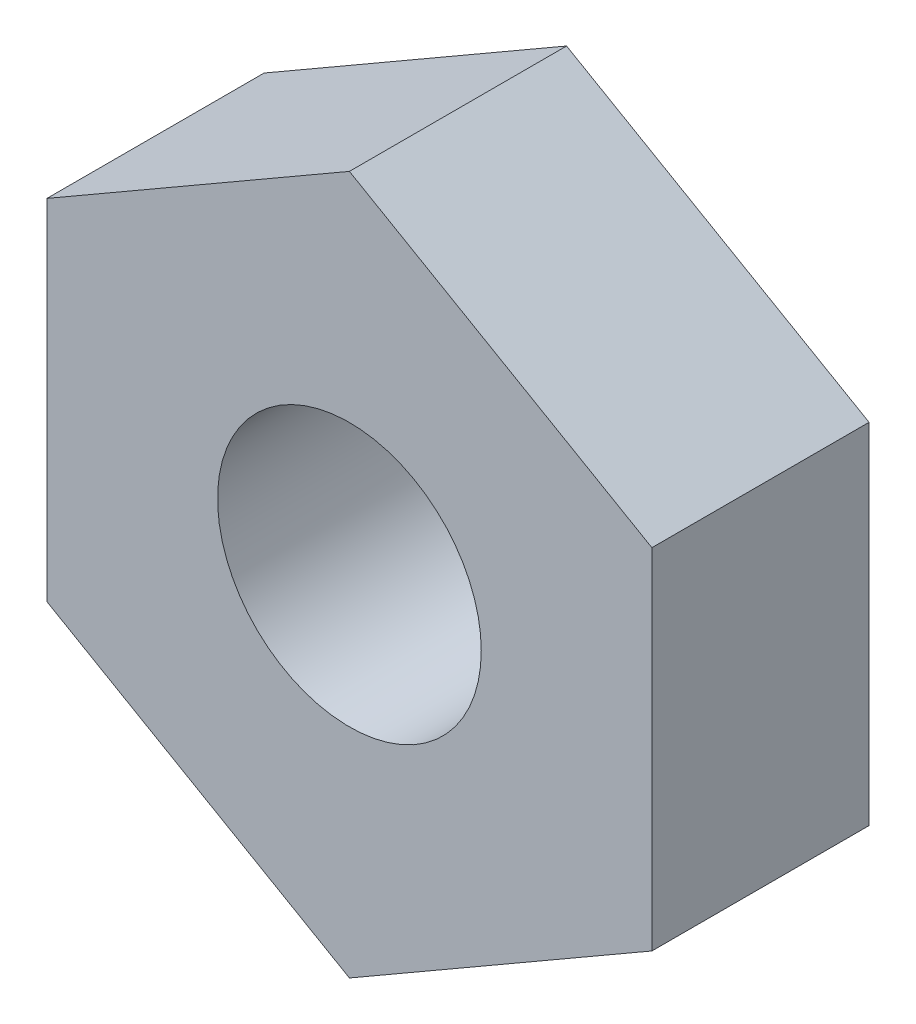
ISO-10303-21;
HEADER;
FILE_DESCRIPTION(('STEP AP214'),'2;1');
FILE_NAME('part.step','',(''),(''),'','','');
FILE_SCHEMA(('AUTOMOTIVE_DESIGN { 1 0 10303 214 1 1 1 1 }'));
ENDSEC;
DATA;
#1=APPLICATION_CONTEXT('core data for automotive mechanical design processes');
#2=APPLICATION_PROTOCOL_DEFINITION('international standard','automotive_design',2000,#1);
#3=PRODUCT_CONTEXT('',#1,'mechanical');
#4=PRODUCT('Part','Part','',(#3));
#5=PRODUCT_RELATED_PRODUCT_CATEGORY('part','',(#4));
#6=PRODUCT_DEFINITION_FORMATION('','',#4);
#7=PRODUCT_DEFINITION_CONTEXT('part definition',#1,'design');
#8=PRODUCT_DEFINITION('design','',#6,#7);
#9=PRODUCT_DEFINITION_SHAPE('','',#8);
#10=(LENGTH_UNIT() NAMED_UNIT(*) SI_UNIT(.MILLI.,.METRE.));
#11=(NAMED_UNIT(*) PLANE_ANGLE_UNIT() SI_UNIT($,.RADIAN.));
#12=(NAMED_UNIT(*) SI_UNIT($,.STERADIAN.) SOLID_ANGLE_UNIT());
#13=UNCERTAINTY_MEASURE_WITH_UNIT(LENGTH_MEASURE(1.E-05),#10,'distance_accuracy_value','');
#14=(GEOMETRIC_REPRESENTATION_CONTEXT(3) GLOBAL_UNCERTAINTY_ASSIGNED_CONTEXT((#13)) GLOBAL_UNIT_ASSIGNED_CONTEXT((#10,
#11,#12)) REPRESENTATION_CONTEXT('',''));
#15=CARTESIAN_POINT('',(0.,0.,0.));
#16=DIRECTION('',(0.,0.,1.));
#17=DIRECTION('',(1.,0.,0.));
#18=AXIS2_PLACEMENT_3D('',#15,#16,#17);
#19=CARTESIAN_POINT('',(0.,0.,1.39999999999998));
#20=DIRECTION('',(0.,0.,1.00000000000005));
#21=DIRECTION('',(1.,0.,0.));
#22=AXIS2_PLACEMENT_3D('',#19,#20,#21);
#23=PLANE('',#22);
#24=CARTESIAN_POINT('',(0.,0.,1.39999999999998));
#25=DIRECTION('',(0.,0.,1.00000000000005));
#26=DIRECTION('',(1.,0.,0.));
#27=AXIS2_PLACEMENT_3D('',#24,#25,#26);
#28=CIRCLE('',#27,0.85);
#29=CARTESIAN_POINT('',(0.85,0.,1.39999999999998));
#30=VERTEX_POINT('',#29);
#31=EDGE_CURVE('E94',#30,#30,#28,.T.);
#32=ORIENTED_EDGE('',*,*,#31,.F.);
#33=EDGE_LOOP('',(#32));
#34=FACE_BOUND('',#33,.T.);
#35=DIRECTION('',(-0.866025403784439,-0.500000000000024,0.));
#36=VECTOR('',#35,1.);
#37=CARTESIAN_POINT('',(0.975000000000004,-1.68874953737963,1.4));
#38=LINE('',#37,#36);
#39=CARTESIAN_POINT('',(1.95000000000001,-1.1258330249197,1.40000000000003));
#40=VERTEX_POINT('',#39);
#41=CARTESIAN_POINT('',(2.77916578639292E-10,-2.25166604999999,1.40000000000001));
#42=VERTEX_POINT('',#41);
#43=EDGE_CURVE('E75',#40,#42,#38,.T.);
#44=ORIENTED_EDGE('',*,*,#43,.F.);
#45=DIRECTION('',(0.,-1.00000000000005,0.));
#46=VECTOR('',#45,1.);
#47=CARTESIAN_POINT('',(1.95000000000001,0.,1.39999999999998));
#48=LINE('',#47,#46);
#49=CARTESIAN_POINT('',(1.95000000000001,1.12583302524077,1.39999999999997));
#50=VERTEX_POINT('',#49);
#51=EDGE_CURVE('E134',#50,#40,#48,.T.);
#52=ORIENTED_EDGE('',*,*,#51,.F.);
#53=DIRECTION('',(0.866025403784439,-0.500000000000024,0.));
#54=VECTOR('',#53,1.);
#55=CARTESIAN_POINT('',(0.975000000000004,1.68874953737969,1.40000000000001));
#56=LINE('',#55,#54);
#57=CARTESIAN_POINT('',(-2.77916578639292E-10,2.25166605000021,1.39999999999997));
#58=VERTEX_POINT('',#57);
#59=EDGE_CURVE('E32',#58,#50,#56,.T.);
#60=ORIENTED_EDGE('',*,*,#59,.F.);
#61=DIRECTION('',(0.866025403784439,0.500000000000024,0.));
#62=VECTOR('',#61,1.);
#63=CARTESIAN_POINT('',(-0.975000000000004,1.68874953737969,1.40000000000001));
#64=LINE('',#63,#62);
#65=CARTESIAN_POINT('',(-1.95000000027792,1.12583302475933,1.4));
#66=VERTEX_POINT('',#65);
#67=EDGE_CURVE('E40',#66,#58,#64,.T.);
#68=ORIENTED_EDGE('',*,*,#67,.F.);
#69=DIRECTION('',(0.,1.00000000000005,0.));
#70=VECTOR('',#69,1.);
#71=CARTESIAN_POINT('',(-1.95000000000001,0.,1.39999999999998));
#72=LINE('',#71,#70);
#73=CARTESIAN_POINT('',(-1.95000000000001,-1.12583302524055,1.40000000000001));
#74=VERTEX_POINT('',#73);
#75=EDGE_CURVE('E110',#74,#66,#72,.T.);
#76=ORIENTED_EDGE('',*,*,#75,.F.);
#77=DIRECTION('',(-0.866025403784438,0.500000000000024,0.));
#78=VECTOR('',#77,1.);
#79=CARTESIAN_POINT('',(-0.975000000000004,-1.68874953737963,1.4));
#80=LINE('',#79,#78);
#81=EDGE_CURVE('E81',#42,#74,#80,.T.);
#82=ORIENTED_EDGE('',*,*,#81,.F.);
#83=EDGE_LOOP('',(#44,#52,#60,#68,#76,#82));
#84=FACE_BOUND('',#83,.T.);
#85=ADVANCED_FACE('F16',(#34,#84),#23,.T.);
#86=CARTESIAN_POINT('',(0.,0.,0.));
#87=DIRECTION('',(0.,0.,-1.00000000000005));
#88=DIRECTION('',(-1.,0.,0.));
#89=AXIS2_PLACEMENT_3D('',#86,#87,#88);
#90=PLANE('',#89);
#91=CARTESIAN_POINT('',(0.,0.,0.));
#92=DIRECTION('',(0.,0.,-1.00000000000005));
#93=DIRECTION('',(-1.,0.,0.));
#94=AXIS2_PLACEMENT_3D('',#91,#92,#93);
#95=CIRCLE('',#94,0.85);
#96=CARTESIAN_POINT('',(-0.85,0.,0.));
#97=VERTEX_POINT('',#96);
#98=EDGE_CURVE('E19',#97,#97,#95,.T.);
#99=ORIENTED_EDGE('',*,*,#98,.F.);
#100=EDGE_LOOP('',(#99));
#101=FACE_BOUND('',#100,.T.);
#102=DIRECTION('',(0.866025403784439,0.500000000000024,0.));
#103=VECTOR('',#102,1.);
#104=CARTESIAN_POINT('',(0.975000000000004,-1.68874953737963,0.));
#105=LINE('',#104,#103);
#106=CARTESIAN_POINT('',(0.,-2.25166604983951,0.));
#107=VERTEX_POINT('',#106);
#108=CARTESIAN_POINT('',(1.95000000000001,-1.12583302491975,0.));
#109=VERTEX_POINT('',#108);
#110=EDGE_CURVE('E73',#107,#109,#105,.T.);
#111=ORIENTED_EDGE('',*,*,#110,.F.);
#112=DIRECTION('',(0.866025403784438,-0.500000000000024,0.));
#113=VECTOR('',#112,1.);
#114=CARTESIAN_POINT('',(-0.975000000000004,-1.68874953737963,0.));
#115=LINE('',#114,#113);
#116=CARTESIAN_POINT('',(-1.95000000000001,-1.12583302491975,0.));
#117=VERTEX_POINT('',#116);
#118=EDGE_CURVE('E88',#117,#107,#115,.T.);
#119=ORIENTED_EDGE('',*,*,#118,.F.);
#120=DIRECTION('',(0.,-1.00000000000005,0.));
#121=VECTOR('',#120,1.);
#122=CARTESIAN_POINT('',(-1.95000000000001,0.,0.));
#123=LINE('',#122,#121);
#124=CARTESIAN_POINT('',(-1.95000000000001,1.12583302491992,0.));
#125=VERTEX_POINT('',#124);
#126=EDGE_CURVE('E80',#125,#117,#123,.T.);
#127=ORIENTED_EDGE('',*,*,#126,.F.);
#128=DIRECTION('',(-0.866025403784439,-0.500000000000024,0.));
#129=VECTOR('',#128,1.);
#130=CARTESIAN_POINT('',(-0.975000000000004,1.68874953737971,0.));
#131=LINE('',#130,#129);
#132=CARTESIAN_POINT('',(0.,2.25166604983956,0.));
#133=VERTEX_POINT('',#132);
#134=EDGE_CURVE('E115',#133,#125,#131,.T.);
#135=ORIENTED_EDGE('',*,*,#134,.F.);
#136=DIRECTION('',(-0.866025403784439,0.500000000000024,0.));
#137=VECTOR('',#136,1.);
#138=CARTESIAN_POINT('',(0.975000000000004,1.68874953737971,0.));
#139=LINE('',#138,#137);
#140=CARTESIAN_POINT('',(1.95000000000001,1.12583302491975,0.));
#141=VERTEX_POINT('',#140);
#142=EDGE_CURVE('E124',#141,#133,#139,.T.);
#143=ORIENTED_EDGE('',*,*,#142,.F.);
#144=DIRECTION('',(0.,1.00000000000005,0.));
#145=VECTOR('',#144,1.);
#146=CARTESIAN_POINT('',(1.95000000000001,0.,0.));
#147=LINE('',#146,#145);
#148=EDGE_CURVE('E92',#109,#141,#147,.T.);
#149=ORIENTED_EDGE('',*,*,#148,.F.);
#150=EDGE_LOOP('',(#111,#119,#127,#135,#143,#149));
#151=FACE_BOUND('',#150,.T.);
#152=ADVANCED_FACE('F86',(#101,#151),#90,.T.);
#153=CARTESIAN_POINT('',(1.95000000000001,0.,-0.999999999999987));
#154=DIRECTION('',(-1.,0.,0.));
#155=DIRECTION('',(0.,0.,1.00000000000005));
#156=AXIS2_PLACEMENT_3D('',#153,#154,#155);
#157=PLANE('',#156);
#158=DIRECTION('',(0.,0.,1.00000000000005));
#159=VECTOR('',#158,1.);
#160=CARTESIAN_POINT('',(1.95000000000001,-1.12583302524061,0.));
#161=LINE('',#160,#159);
#162=EDGE_CURVE('E11',#40,#109,#161,.F.);
#163=ORIENTED_EDGE('',*,*,#162,.T.);
#164=ORIENTED_EDGE('',*,*,#148,.T.);
#165=DIRECTION('',(0.,0.,1.00000000000005));
#166=VECTOR('',#165,1.);
#167=CARTESIAN_POINT('',(1.95000000000001,1.125833025241,0.));
#168=LINE('',#167,#166);
#169=EDGE_CURVE('E25',#141,#50,#168,.T.);
#170=ORIENTED_EDGE('',*,*,#169,.T.);
#171=ORIENTED_EDGE('',*,*,#51,.T.);
#172=EDGE_LOOP('',(#163,#164,#170,#171));
#173=FACE_BOUND('',#172,.T.);
#174=ADVANCED_FACE('F141',(#173),#157,.F.);
#175=CARTESIAN_POINT('',(0.975000000000004,1.68874953737969,-1.00000000000003));
#176=DIRECTION('',(-0.5,-0.866025403784481,0.));
#177=DIRECTION('',(0.,0.,1.00000000000005));
#178=AXIS2_PLACEMENT_3D('',#175,#176,#177);
#179=PLANE('',#178);
#180=DIRECTION('',(0.,0.,1.00000000000005));
#181=VECTOR('',#180,1.);
#182=CARTESIAN_POINT('',(-2.77916578639292E-10,2.25166605000005,0.));
#183=LINE('',#182,#181);
#184=EDGE_CURVE('E130',#133,#58,#183,.T.);
#185=ORIENTED_EDGE('',*,*,#184,.T.);
#186=ORIENTED_EDGE('',*,*,#59,.T.);
#187=ORIENTED_EDGE('',*,*,#169,.F.);
#188=ORIENTED_EDGE('',*,*,#142,.T.);
#189=EDGE_LOOP('',(#185,#186,#187,#188));
#190=FACE_BOUND('',#189,.T.);
#191=ADVANCED_FACE('F148',(#190),#179,.F.);
#192=CARTESIAN_POINT('',(-0.975000000000004,1.68874953737969,-1.00000000000003));
#193=DIRECTION('',(0.5,-0.866025403784481,0.));
#194=DIRECTION('',(0.,0.,1.00000000000005));
#195=AXIS2_PLACEMENT_3D('',#192,#193,#194);
#196=PLANE('',#195);
#197=DIRECTION('',(0.,0.,1.00000000000005));
#198=VECTOR('',#197,1.);
#199=CARTESIAN_POINT('',(-1.95000000027792,1.12583302475933,0.));
#200=LINE('',#199,#198);
#201=EDGE_CURVE('E121',#125,#66,#200,.T.);
#202=ORIENTED_EDGE('',*,*,#201,.T.);
#203=ORIENTED_EDGE('',*,*,#67,.T.);
#204=ORIENTED_EDGE('',*,*,#184,.F.);
#205=ORIENTED_EDGE('',*,*,#134,.T.);
#206=EDGE_LOOP('',(#202,#203,#204,#205));
#207=FACE_BOUND('',#206,.T.);
#208=ADVANCED_FACE('F147',(#207),#196,.F.);
#209=CARTESIAN_POINT('',(-1.95000000000001,0.,-0.999999999999987));
#210=DIRECTION('',(1.,0.,0.));
#211=DIRECTION('',(0.,0.,1.00000000000005));
#212=AXIS2_PLACEMENT_3D('',#209,#210,#211);
#213=PLANE('',#212);
#214=DIRECTION('',(0.,0.,1.00000000000005));
#215=VECTOR('',#214,1.);
#216=CARTESIAN_POINT('',(-1.95000000000001,-1.12583302524061,0.));
#217=LINE('',#216,#215);
#218=EDGE_CURVE('E98',#117,#74,#217,.T.);
#219=ORIENTED_EDGE('',*,*,#218,.T.);
#220=ORIENTED_EDGE('',*,*,#75,.T.);
#221=ORIENTED_EDGE('',*,*,#201,.F.);
#222=ORIENTED_EDGE('',*,*,#126,.T.);
#223=EDGE_LOOP('',(#219,#220,#221,#222));
#224=FACE_BOUND('',#223,.T.);
#225=ADVANCED_FACE('F145',(#224),#213,.F.);
#226=CARTESIAN_POINT('',(-0.975000000000004,-1.68874953737946,-0.999999999999987));
#227=DIRECTION('',(0.5,0.866025403784481,0.));
#228=DIRECTION('',(0.,0.,1.00000000000005));
#229=AXIS2_PLACEMENT_3D('',#226,#227,#228);
#230=PLANE('',#229);
#231=DIRECTION('',(0.,0.,1.00000000000005));
#232=VECTOR('',#231,1.);
#233=CARTESIAN_POINT('',(2.77916578639292E-10,-2.25166604999999,0.));
#234=LINE('',#233,#232);
#235=EDGE_CURVE('E70',#107,#42,#234,.T.);
#236=ORIENTED_EDGE('',*,*,#235,.T.);
#237=ORIENTED_EDGE('',*,*,#81,.T.);
#238=ORIENTED_EDGE('',*,*,#218,.F.);
#239=ORIENTED_EDGE('',*,*,#118,.T.);
#240=EDGE_LOOP('',(#236,#237,#238,#239));
#241=FACE_BOUND('',#240,.T.);
#242=ADVANCED_FACE('F96',(#241),#230,.F.);
#243=CARTESIAN_POINT('',(0.975000000000004,-1.68874953737946,-0.999999999999987));
#244=DIRECTION('',(-0.5,0.866025403784481,0.));
#245=DIRECTION('',(0.,0.,1.00000000000005));
#246=AXIS2_PLACEMENT_3D('',#243,#244,#245);
#247=PLANE('',#246);
#248=ORIENTED_EDGE('',*,*,#43,.T.);
#249=ORIENTED_EDGE('',*,*,#235,.F.);
#250=ORIENTED_EDGE('',*,*,#110,.T.);
#251=ORIENTED_EDGE('',*,*,#162,.F.);
#252=EDGE_LOOP('',(#248,#249,#250,#251));
#253=FACE_BOUND('',#252,.T.);
#254=ADVANCED_FACE('F72',(#253),#247,.F.);
#255=CARTESIAN_POINT('',(0.,0.,-0.500000000000014));
#256=DIRECTION('',(0.,0.,1.00000000000005));
#257=DIRECTION('',(1.,0.,0.));
#258=AXIS2_PLACEMENT_3D('',#255,#256,#257);
#259=CYLINDRICAL_SURFACE('',#258,0.85);
#260=ORIENTED_EDGE('',*,*,#31,.T.);
#261=EDGE_LOOP('',(#260));
#262=FACE_BOUND('',#261,.T.);
#263=ORIENTED_EDGE('',*,*,#98,.T.);
#264=EDGE_LOOP('',(#263));
#265=FACE_BOUND('',#264,.T.);
#266=ADVANCED_FACE('F173',(#262,#265),#259,.F.);
#267=CLOSED_SHELL('',(#85,#152,#174,#191,#208,#225,#242,#254,#266));
#268=MANIFOLD_SOLID_BREP('B1',#267);
#269=ADVANCED_BREP_SHAPE_REPRESENTATION('',(#18,#268),#14);
#270=SHAPE_DEFINITION_REPRESENTATION(#9,#269);
ENDSEC;
END-ISO-10303-21;
